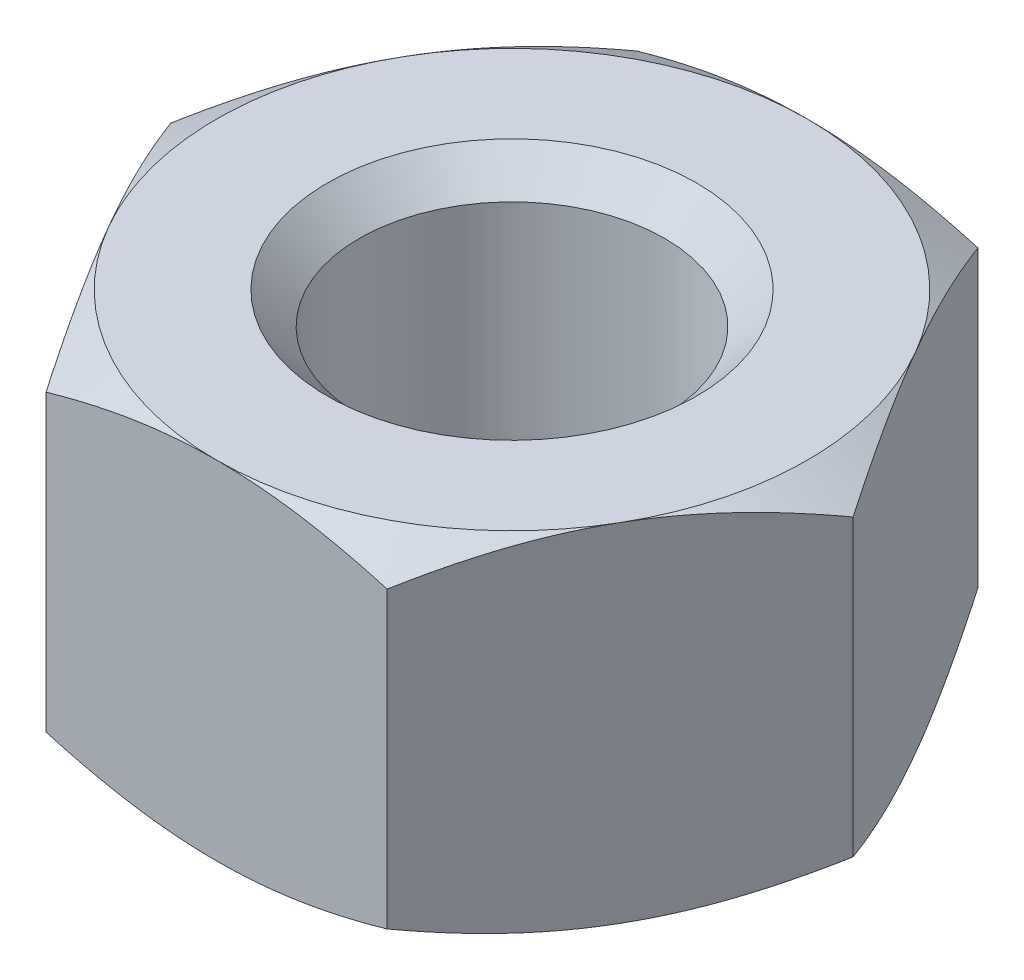
ISO-10303-21;
HEADER;
FILE_DESCRIPTION(('STEP AP214'),'2;1');
FILE_NAME('part.step','',(''),(''),'','','');
FILE_SCHEMA(('AUTOMOTIVE_DESIGN { 1 0 10303 214 1 1 1 1 }'));
ENDSEC;
DATA;
#1=APPLICATION_CONTEXT('core data for automotive mechanical design processes');
#2=APPLICATION_PROTOCOL_DEFINITION('international standard','automotive_design',2000,#1);
#3=PRODUCT_CONTEXT('',#1,'mechanical');
#4=PRODUCT('Part','Part','',(#3));
#5=PRODUCT_RELATED_PRODUCT_CATEGORY('part','',(#4));
#6=PRODUCT_DEFINITION_FORMATION('','',#4);
#7=PRODUCT_DEFINITION_CONTEXT('part definition',#1,'design');
#8=PRODUCT_DEFINITION('design','',#6,#7);
#9=PRODUCT_DEFINITION_SHAPE('','',#8);
#10=(LENGTH_UNIT() NAMED_UNIT(*) SI_UNIT(.MILLI.,.METRE.));
#11=(NAMED_UNIT(*) PLANE_ANGLE_UNIT() SI_UNIT($,.RADIAN.));
#12=(NAMED_UNIT(*) SI_UNIT($,.STERADIAN.) SOLID_ANGLE_UNIT());
#13=UNCERTAINTY_MEASURE_WITH_UNIT(LENGTH_MEASURE(1.E-05),#10,'distance_accuracy_value','');
#14=(GEOMETRIC_REPRESENTATION_CONTEXT(3) GLOBAL_UNCERTAINTY_ASSIGNED_CONTEXT((#13)) GLOBAL_UNIT_ASSIGNED_CONTEXT((#10,
#11,#12)) REPRESENTATION_CONTEXT('',''));
#15=CARTESIAN_POINT('',(0.,0.,0.));
#16=DIRECTION('',(0.,0.,1.));
#17=DIRECTION('',(1.,0.,0.));
#18=AXIS2_PLACEMENT_3D('',#15,#16,#17);
#19=CARTESIAN_POINT('',(0.,0.,0.));
#20=DIRECTION('',(0.,1.,0.));
#21=DIRECTION('',(0.,0.,1.));
#22=AXIS2_PLACEMENT_3D('',#19,#20,#21);
#23=CONICAL_SURFACE('',#22,4.,1.0471975511966);
#24=CARTESIAN_POINT('',(-4.61880330821755,0.357266256575081,1.99999999892675E-06));
#25=CARTESIAN_POINT('',(-4.51731909764557,0.298657292071255,-0.175773808876671));
#26=CARTESIAN_POINT('',(-4.4149588768546,0.245355497856662,-0.353066911960607));
#27=CARTESIAN_POINT('',(-4.20846613493174,0.152318797743035,-0.710722832365203));
#28=CARTESIAN_POINT('',(-4.10432994600602,0.112616801142602,-0.891092002491144));
#29=CARTESIAN_POINT('',(-3.89734807632659,0.0508177548489514,-1.2495951170215));
#30=CARTESIAN_POINT('',(-3.79453423354484,0.0283093507401665,-1.4276739164409));
#31=CARTESIAN_POINT('',(-3.58842302498515,0.00144399311373537,-1.78466900167571));
#32=CARTESIAN_POINT('',(-3.48512640785602,-0.00293521253205963,-1.96358399079337));
#33=CARTESIAN_POINT('',(-3.29212760794636,0.00619808923008941,-2.29786771803671));
#34=CARTESIAN_POINT('',(-3.20239646475493,0.0174680682685133,-2.4532866170655));
#35=CARTESIAN_POINT('',(-3.02351874775929,0.0531801293376515,-2.76311191124388));
#36=CARTESIAN_POINT('',(-2.93437279218783,0.0776343987077922,-2.91751723558292));
#37=CARTESIAN_POINT('',(-2.7551265674533,0.138765364665783,-3.22798080388804));
#38=CARTESIAN_POINT('',(-2.66504897298206,0.1757010716321,-3.38399977413581));
#39=CARTESIAN_POINT('',(-2.4862369061122,0.259529521182041,-3.69371135896082));
#40=CARTESIAN_POINT('',(-2.39750014467494,0.30640257994092,-3.84740793826927));
#41=CARTESIAN_POINT('',(-2.30939992205797,0.35726625657508,-4.000002));
#42=B_SPLINE_CURVE_WITH_KNOTS('',3,(#24,#25,#26,#27,#28,#29,#30,#31,#32,#33,#34,#35,#36,#37,#38,
#39,#40,#41),.UNSPECIFIED.,.F.,.F.,(4,2,2,2,2,2,2,2,4),(0.,0.634032181234025,1.26958795462497,
1.88941567588753,2.50848238266276,3.04741719213437,3.58685104031438,4.1382469778288,
4.68856075235001),.UNSPECIFIED.);
#43=CARTESIAN_POINT('',(-3.46410161513775,0.,-2.));
#44=VERTEX_POINT('',#43);
#45=CARTESIAN_POINT('',(-2.3094010767585,0.357265589908163,-4.));
#46=VERTEX_POINT('',#45);
#47=EDGE_CURVE('E222',#44,#46,#42,.T.);
#48=ORIENTED_EDGE('',*,*,#47,.T.);
#49=CARTESIAN_POINT('',(-6.12496791328576,1.91415319023748,-4.));
#50=CARTESIAN_POINT('',(-5.94934454674692,1.82928188046009,-4.));
#51=CARTESIAN_POINT('',(-5.77330595944165,1.74525423234508,-4.));
#52=CARTESIAN_POINT('',(-5.42017383412661,1.57936835460172,-4.));
#53=CARTESIAN_POINT('',(-5.24308011989033,1.49751050056147,-4.));
#54=CARTESIAN_POINT('',(-4.88665663294971,1.33601509539964,-4.));
#55=CARTESIAN_POINT('',(-4.70731986372955,1.25639292996096,-4.));
#56=CARTESIAN_POINT('',(-4.34717236999863,1.10056842575945,-4.));
#57=CARTESIAN_POINT('',(-4.16636172289676,1.02436590874491,-4.));
#58=CARTESIAN_POINT('',(-3.80073383205831,0.875385174541293,-4.));
#59=CARTESIAN_POINT('',(-3.61589465300084,0.802660495670861,-4.));
#60=CARTESIAN_POINT('',(-3.24403613492685,0.662906680302123,-4.));
#61=CARTESIAN_POINT('',(-3.05701655598148,0.595878177461809,-4.));
#62=CARTESIAN_POINT('',(-2.68088378597247,0.469317681556577,-4.));
#63=CARTESIAN_POINT('',(-2.49177601262329,0.409769751778633,-4.));
#64=CARTESIAN_POINT('',(-2.11087204671964,0.300104263766314,-4.));
#65=CARTESIAN_POINT('',(-1.91907672500189,0.249983723410642,-4.));
#66=CARTESIAN_POINT('',(-1.53266670507117,0.161606179599127,-4.));
#67=CARTESIAN_POINT('',(-1.3380512717393,0.12335232985726,-4.));
#68=CARTESIAN_POINT('',(-0.946473904052724,0.0612837042111804,-4.));
#69=CARTESIAN_POINT('',(-0.749511967640737,0.0374689409672343,-4.));
#70=CARTESIAN_POINT('',(-0.355519691096354,0.00638525989059735,-4.));
#71=CARTESIAN_POINT('',(-0.158497830861486,-0.000988416177660899,-4.));
#72=CARTESIAN_POINT('',(0.235408087238719,0.00120185676655598,-4.));
#73=CARTESIAN_POINT('',(0.432292167601184,0.0107614086185328,-4.));
#74=CARTESIAN_POINT('',(0.76849724477752,0.0408718597165423,-4.));
#75=CARTESIAN_POINT('',(0.908189149006597,0.0575009490345312,-4.));
#76=CARTESIAN_POINT('',(1.18649394400598,0.0982020119049957,-4.));
#77=CARTESIAN_POINT('',(1.32510666107962,0.12227515919873,-4.));
#78=CARTESIAN_POINT('',(1.73921300262621,0.20439728470357,-4.));
#79=CARTESIAN_POINT('',(2.01276564710678,0.272327804475224,-4.));
#80=CARTESIAN_POINT('',(2.4220957629485,0.389490408321359,-4.));
#81=CARTESIAN_POINT('',(2.56000684474927,0.431686387730949,-4.));
#82=CARTESIAN_POINT('',(2.83438958957609,0.520253865037997,-4.));
#83=CARTESIAN_POINT('',(2.97086217385934,0.566622483018704,-4.));
#84=CARTESIAN_POINT('',(3.24179724020976,0.662570371320852,-4.));
#85=CARTESIAN_POINT('',(3.37626671271993,0.712130101245038,-4.));
#86=CARTESIAN_POINT('',(3.64416233700232,0.814158580056112,-4.));
#87=CARTESIAN_POINT('',(3.77758804191473,0.866628504588586,-4.));
#88=CARTESIAN_POINT('',(3.91053130066118,0.920266349538454,-4.));
#89=B_SPLINE_CURVE_WITH_KNOTS('',3,(#49,#50,#51,#52,#53,#54,#55,#56,#57,#58,#59,#60,#61,#62,#63,
#64,#65,#66,#67,#68,#69,#70,#71,#72,#73,#74,#75,#76,#77,#78,#79,#80,#81,#82,#83,#84,#85,#86,#87,
#88),.UNSPECIFIED.,.F.,.F.,(4,2,2,2,2,2,2,2,2,2,2,2,2,2,2,2,2,2,2,4),(0.,0.585174800843114,
1.17045024170061,1.7590748100038,2.34766866009096,2.94349007578714,3.53937768573826,
4.13397346685478,4.72838084483344,5.32294605856348,5.91751179361064,6.50827815512904,
7.09889113102511,7.52071973285857,7.94261488042752,8.78703304772405,9.21966451857854,
9.65199964840548,10.0819013472715,10.5119779988031),.UNSPECIFIED.);
#90=CARTESIAN_POINT('',(0.,0.,-4.));
#91=VERTEX_POINT('',#90);
#92=EDGE_CURVE('E118',#46,#91,#89,.T.);
#93=ORIENTED_EDGE('',*,*,#92,.T.);
#94=CARTESIAN_POINT('',(0.,0.,0.));
#95=DIRECTION('',(0.,-1.,0.));
#96=DIRECTION('',(0.,0.,-1.));
#97=AXIS2_PLACEMENT_3D('',#94,#95,#96);
#98=CIRCLE('',#97,4.);
#99=EDGE_CURVE('E254',#44,#91,#98,.T.);
#100=ORIENTED_EDGE('',*,*,#99,.F.);
#101=EDGE_LOOP('',(#48,#93,#100));
#102=FACE_BOUND('',#101,.T.);
#103=ADVANCED_FACE('F15',(#102),#23,.T.);
#104=CARTESIAN_POINT('',(3.46410161513775,0.,-2.));
#105=VERTEX_POINT('',#104);
#106=EDGE_CURVE('E246',#91,#105,#98,.T.);
#107=ORIENTED_EDGE('',*,*,#106,.F.);
#108=CARTESIAN_POINT('',(2.30940107675851,0.357265589908163,-4.));
#109=VERTEX_POINT('',#108);
#110=EDGE_CURVE('E216',#91,#109,#89,.T.);
#111=ORIENTED_EDGE('',*,*,#110,.T.);
#112=CARTESIAN_POINT('',(2.30939992205797,0.35726625657508,-4.000002));
#113=CARTESIAN_POINT('',(2.41088413262994,0.298657292071257,-3.82422619112333));
#114=CARTESIAN_POINT('',(2.51324435342091,0.245355497856665,-3.64693308803939));
#115=CARTESIAN_POINT('',(2.71973709534377,0.152318797743039,-3.2892771676348));
#116=CARTESIAN_POINT('',(2.82387328426949,0.112616801142605,-3.10890799750885));
#117=CARTESIAN_POINT('',(3.03085515394892,0.0508177548489549,-2.75040488297849));
#118=CARTESIAN_POINT('',(3.13366899673067,0.0283093507401705,-2.5723260835591));
#119=CARTESIAN_POINT('',(3.33978020529036,0.00144399311373762,-2.21533099832428));
#120=CARTESIAN_POINT('',(3.44307682241949,-0.00293521253205958,-2.03641600920663));
#121=CARTESIAN_POINT('',(3.63607562232915,0.00619808923008982,-1.70213228196329));
#122=CARTESIAN_POINT('',(3.72580676552058,0.0174680682685157,-1.5467133829345));
#123=CARTESIAN_POINT('',(3.90468448251622,0.0531801293376555,-1.23688808875612));
#124=CARTESIAN_POINT('',(3.99383043808768,0.0776343987077959,-1.08248276441708));
#125=CARTESIAN_POINT('',(4.17307666282221,0.138765364665786,-0.772019196111962));
#126=CARTESIAN_POINT('',(4.26315425729345,0.175701071632103,-0.61600022586419));
#127=CARTESIAN_POINT('',(4.44196632416331,0.259529521182044,-0.306288641039182));
#128=CARTESIAN_POINT('',(4.53070308560057,0.306402579940922,-0.152592061730728));
#129=CARTESIAN_POINT('',(4.61880330821755,0.35726625657508,2.00000000027449E-06));
#130=B_SPLINE_CURVE_WITH_KNOTS('',3,(#112,#113,#114,#115,#116,#117,#118,#119,#120,#121,#122,
#123,#124,#125,#126,#127,#128,#129),.UNSPECIFIED.,.F.,.F.,(4,2,2,2,2,2,2,2,4),(0.,
0.634032181234024,1.26958795462496,1.88941567588753,2.50848238266275,3.04741719213436,
3.58685104031437,4.1382469778288,4.68856075235001),.UNSPECIFIED.);
#131=EDGE_CURVE('E210',#109,#105,#130,.T.);
#132=ORIENTED_EDGE('',*,*,#131,.T.);
#133=EDGE_LOOP('',(#107,#111,#132));
#134=FACE_BOUND('',#133,.T.);
#135=ADVANCED_FACE('F243',(#134),#23,.T.);
#136=CARTESIAN_POINT('',(3.46410161513775,0.,2.));
#137=VERTEX_POINT('',#136);
#138=EDGE_CURVE('E252',#105,#137,#98,.T.);
#139=ORIENTED_EDGE('',*,*,#138,.F.);
#140=CARTESIAN_POINT('',(4.61880215351701,0.357265589908163,0.));
#141=VERTEX_POINT('',#140);
#142=EDGE_CURVE('E202',#105,#141,#130,.T.);
#143=ORIENTED_EDGE('',*,*,#142,.T.);
#144=CARTESIAN_POINT('',(4.61880330821754,0.35726625657508,-1.99999999971719E-06));
#145=CARTESIAN_POINT('',(4.51731909764557,0.298657292071254,0.175773808876672));
#146=CARTESIAN_POINT('',(4.4149588768546,0.245355497856662,0.353066911960608));
#147=CARTESIAN_POINT('',(4.20846613493174,0.152318797743036,0.710722832365205));
#148=CARTESIAN_POINT('',(4.10432994600602,0.112616801142602,0.891092002491145));
#149=CARTESIAN_POINT('',(3.8973480763266,0.0508177548489516,1.2495951170215));
#150=CARTESIAN_POINT('',(3.79453423354484,0.0283093507401669,1.4276739164409));
#151=CARTESIAN_POINT('',(3.58842302498515,0.00144399311373523,1.78466900167571));
#152=CARTESIAN_POINT('',(3.48512640785602,-0.00293521253206043,1.96358399079336));
#153=CARTESIAN_POINT('',(3.29212760794636,0.00619808923008863,2.29786771803671));
#154=CARTESIAN_POINT('',(3.20239646475493,0.0174680682685131,2.45328661706549));
#155=CARTESIAN_POINT('',(3.02351874775929,0.0531801293376517,2.76311191124388));
#156=CARTESIAN_POINT('',(2.93437279218783,0.0776343987077922,2.91751723558292));
#157=CARTESIAN_POINT('',(2.7551265674533,0.138765364665782,3.22798080388804));
#158=CARTESIAN_POINT('',(2.66504897298206,0.1757010716321,3.38399977413581));
#159=CARTESIAN_POINT('',(2.4862369061122,0.259529521182041,3.69371135896082));
#160=CARTESIAN_POINT('',(2.39750014467494,0.306402579940921,3.84740793826927));
#161=CARTESIAN_POINT('',(2.30939992205796,0.357266256575081,4.000002));
#162=B_SPLINE_CURVE_WITH_KNOTS('',3,(#144,#145,#146,#147,#148,#149,#150,#151,#152,#153,#154,
#155,#156,#157,#158,#159,#160,#161),.UNSPECIFIED.,.F.,.F.,(4,2,2,2,2,2,2,2,4),(0.,
0.634032181234023,1.26958795462496,1.88941567588752,2.50848238266275,3.04741719213436,
3.58685104031437,4.1382469778288,4.68856075235001),.UNSPECIFIED.);
#163=EDGE_CURVE('E361',#141,#137,#162,.T.);
#164=ORIENTED_EDGE('',*,*,#163,.T.);
#165=EDGE_LOOP('',(#139,#143,#164));
#166=FACE_BOUND('',#165,.T.);
#167=ADVANCED_FACE('F330',(#166),#23,.T.);
#168=CARTESIAN_POINT('',(-2.30939992205797,0.357266256575081,4.000002));
#169=CARTESIAN_POINT('',(-2.41088413262994,0.298657292071257,3.82422619112333));
#170=CARTESIAN_POINT('',(-2.51324435342091,0.245355497856665,3.64693308803939));
#171=CARTESIAN_POINT('',(-2.71973709534377,0.152318797743039,3.2892771676348));
#172=CARTESIAN_POINT('',(-2.82387328426949,0.112616801142605,3.10890799750885));
#173=CARTESIAN_POINT('',(-3.03085515394892,0.0508177548489549,2.75040488297849));
#174=CARTESIAN_POINT('',(-3.13366899673067,0.0283093507401703,2.5723260835591));
#175=CARTESIAN_POINT('',(-3.33978020529036,0.00144399311373751,2.21533099832428));
#176=CARTESIAN_POINT('',(-3.44307682241949,-0.00293521253205965,2.03641600920663));
#177=CARTESIAN_POINT('',(-3.63607562232915,0.00619808923008974,1.70213228196329));
#178=CARTESIAN_POINT('',(-3.72580676552058,0.0174680682685155,1.5467133829345));
#179=CARTESIAN_POINT('',(-3.90468448251622,0.0531801293376554,1.23688808875612));
#180=CARTESIAN_POINT('',(-3.99383043808768,0.0776343987077958,1.08248276441708));
#181=CARTESIAN_POINT('',(-4.17307666282221,0.138765364665786,0.772019196111962));
#182=CARTESIAN_POINT('',(-4.26315425729345,0.175701071632103,0.61600022586419));
#183=CARTESIAN_POINT('',(-4.44196632416331,0.259529521182044,0.306288641039182));
#184=CARTESIAN_POINT('',(-4.53070308560057,0.306402579940922,0.152592061730727));
#185=CARTESIAN_POINT('',(-4.61880330821755,0.35726625657508,-2.00000000108303E-06));
#186=B_SPLINE_CURVE_WITH_KNOTS('',3,(#168,#169,#170,#171,#172,#173,#174,#175,#176,#177,#178,
#179,#180,#181,#182,#183,#184,#185),.UNSPECIFIED.,.F.,.F.,(4,2,2,2,2,2,2,2,4),(0.,
0.634032181234023,1.26958795462496,1.88941567588753,2.50848238266275,3.04741719213436,
3.58685104031437,4.1382469778288,4.68856075235001),.UNSPECIFIED.);
#187=CARTESIAN_POINT('',(-3.46410161513775,0.,2.));
#188=VERTEX_POINT('',#187);
#189=CARTESIAN_POINT('',(-4.61880215351701,0.357265589908164,0.));
#190=VERTEX_POINT('',#189);
#191=EDGE_CURVE('E355',#188,#190,#186,.T.);
#192=ORIENTED_EDGE('',*,*,#191,.T.);
#193=EDGE_CURVE('E211',#190,#44,#42,.T.);
#194=ORIENTED_EDGE('',*,*,#193,.T.);
#195=EDGE_CURVE('E262',#188,#44,#98,.T.);
#196=ORIENTED_EDGE('',*,*,#195,.F.);
#197=EDGE_LOOP('',(#192,#194,#196));
#198=FACE_BOUND('',#197,.T.);
#199=ADVANCED_FACE('F338',(#198),#23,.T.);
#200=CARTESIAN_POINT('',(0.,0.,4.));
#201=VERTEX_POINT('',#200);
#202=EDGE_CURVE('E260',#137,#201,#98,.T.);
#203=ORIENTED_EDGE('',*,*,#202,.F.);
#204=CARTESIAN_POINT('',(2.3094010767585,0.357265589908163,4.));
#205=VERTEX_POINT('',#204);
#206=EDGE_CURVE('E37',#137,#205,#162,.T.);
#207=ORIENTED_EDGE('',*,*,#206,.T.);
#208=CARTESIAN_POINT('',(-6.12496791328576,1.91415319023748,4.));
#209=CARTESIAN_POINT('',(-5.94934454674692,1.82928188046009,4.));
#210=CARTESIAN_POINT('',(-5.77330595944165,1.74525423234508,4.));
#211=CARTESIAN_POINT('',(-5.42017383412661,1.57936835460172,4.));
#212=CARTESIAN_POINT('',(-5.24308011989033,1.49751050056147,4.));
#213=CARTESIAN_POINT('',(-4.88665663294971,1.33601509539964,4.));
#214=CARTESIAN_POINT('',(-4.70731986372955,1.25639292996096,4.));
#215=CARTESIAN_POINT('',(-4.34717236999863,1.10056842575945,4.));
#216=CARTESIAN_POINT('',(-4.16636172289676,1.02436590874491,4.));
#217=CARTESIAN_POINT('',(-3.80073383205831,0.875385174541293,4.));
#218=CARTESIAN_POINT('',(-3.61589465300084,0.802660495670861,4.));
#219=CARTESIAN_POINT('',(-3.24403613492686,0.662906680302123,4.));
#220=CARTESIAN_POINT('',(-3.05701655598148,0.595878177461809,4.));
#221=CARTESIAN_POINT('',(-2.68088378597247,0.469317681556577,4.));
#222=CARTESIAN_POINT('',(-2.49177601262329,0.409769751778634,4.));
#223=CARTESIAN_POINT('',(-2.11087204671965,0.300104263766314,4.));
#224=CARTESIAN_POINT('',(-1.91907672500189,0.249983723410642,4.));
#225=CARTESIAN_POINT('',(-1.53266670507117,0.161606179599127,4.));
#226=CARTESIAN_POINT('',(-1.33805127173931,0.123352329857261,4.));
#227=CARTESIAN_POINT('',(-0.946473904052728,0.0612837042111814,4.));
#228=CARTESIAN_POINT('',(-0.749511967640741,0.0374689409672346,4.));
#229=CARTESIAN_POINT('',(-0.355519691096358,0.00638525989059739,4.));
#230=CARTESIAN_POINT('',(-0.15849783086149,-0.000988416177660527,4.));
#231=CARTESIAN_POINT('',(0.235408087238715,0.0012018567665566,4.));
#232=CARTESIAN_POINT('',(0.432292167601181,0.0107614086185333,4.));
#233=CARTESIAN_POINT('',(0.768497244777516,0.0408718597165427,4.));
#234=CARTESIAN_POINT('',(0.908189149006593,0.0575009490345317,4.));
#235=CARTESIAN_POINT('',(1.18649394400598,0.0982020119049961,4.));
#236=CARTESIAN_POINT('',(1.32510666107962,0.122275159198731,4.));
#237=CARTESIAN_POINT('',(1.7392130026262,0.20439728470357,4.));
#238=CARTESIAN_POINT('',(2.01276564710678,0.272327804475224,4.));
#239=CARTESIAN_POINT('',(2.42209576294849,0.38949040832136,4.));
#240=CARTESIAN_POINT('',(2.56000684474927,0.43168638773095,4.));
#241=CARTESIAN_POINT('',(2.83438958957609,0.520253865037999,4.));
#242=CARTESIAN_POINT('',(2.97086217385934,0.566622483018705,4.));
#243=CARTESIAN_POINT('',(3.24179724020976,0.662570371320853,4.));
#244=CARTESIAN_POINT('',(3.37626671271993,0.712130101245039,4.));
#245=CARTESIAN_POINT('',(3.64416233700232,0.814158580056115,4.));
#246=CARTESIAN_POINT('',(3.77758804191473,0.866628504588589,4.));
#247=CARTESIAN_POINT('',(3.91053130066118,0.920266349538457,4.));
#248=B_SPLINE_CURVE_WITH_KNOTS('',3,(#208,#209,#210,#211,#212,#213,#214,#215,#216,#217,#218,
#219,#220,#221,#222,#223,#224,#225,#226,#227,#228,#229,#230,#231,#232,#233,#234,#235,#236,#237,
#238,#239,#240,#241,#242,#243,#244,#245,#246,#247),.UNSPECIFIED.,.F.,.F.,(4,2,2,2,2,2,2,2,2,2,2,
2,2,2,2,2,2,2,2,4),(0.,0.585174800843114,1.17045024170061,1.7590748100038,2.34766866009095,
2.94349007578714,3.53937768573826,4.13397346685478,4.72838084483343,5.32294605856347,
5.91751179361063,6.50827815512903,7.09889113102511,7.52071973285856,7.94261488042752,
8.78703304772405,9.21966451857854,9.65199964840548,10.0819013472715,10.5119779988031),.UNSPECIFIED.);
#249=EDGE_CURVE('E10',#205,#201,#248,.F.);
#250=ORIENTED_EDGE('',*,*,#249,.T.);
#251=EDGE_LOOP('',(#203,#207,#250));
#252=FACE_BOUND('',#251,.T.);
#253=ADVANCED_FACE('F333',(#252),#23,.T.);
#254=CARTESIAN_POINT('',(-2.30940107675851,0.357265589908163,4.));
#255=VERTEX_POINT('',#254);
#256=EDGE_CURVE('E20',#201,#255,#248,.F.);
#257=ORIENTED_EDGE('',*,*,#256,.T.);
#258=EDGE_CURVE('E125',#255,#188,#186,.T.);
#259=ORIENTED_EDGE('',*,*,#258,.T.);
#260=EDGE_CURVE('E269',#201,#188,#98,.T.);
#261=ORIENTED_EDGE('',*,*,#260,.F.);
#262=EDGE_LOOP('',(#257,#259,#261));
#263=FACE_BOUND('',#262,.T.);
#264=ADVANCED_FACE('F152',(#263),#23,.T.);
#265=CARTESIAN_POINT('',(0.,4.34204283310244,0.));
#266=DIRECTION('',(0.,-1.,0.));
#267=DIRECTION('',(0.,0.,-1.));
#268=AXIS2_PLACEMENT_3D('',#265,#266,#267);
#269=CONICAL_SURFACE('',#268,4.62,1.0471975511966);
#270=CARTESIAN_POINT('',(-6.12496791328576,2.78584680976252,4.));
#271=CARTESIAN_POINT('',(-5.94934454674692,2.87071811953991,4.));
#272=CARTESIAN_POINT('',(-5.77330595944165,2.95474576765493,4.));
#273=CARTESIAN_POINT('',(-5.42017383412661,3.12063164539828,4.));
#274=CARTESIAN_POINT('',(-5.24308011989033,3.20248949943853,4.));
#275=CARTESIAN_POINT('',(-4.88665663294971,3.36398490460037,4.));
#276=CARTESIAN_POINT('',(-4.70731986372955,3.44360707003904,4.));
#277=CARTESIAN_POINT('',(-4.34717236999863,3.59943157424055,4.));
#278=CARTESIAN_POINT('',(-4.16636172289676,3.67563409125509,4.));
#279=CARTESIAN_POINT('',(-3.80073383205831,3.82461482545871,4.));
#280=CARTESIAN_POINT('',(-3.61589465300084,3.89733950432914,4.));
#281=CARTESIAN_POINT('',(-3.24403613492686,4.03709331969788,4.));
#282=CARTESIAN_POINT('',(-3.05701655598148,4.10412182253819,4.));
#283=CARTESIAN_POINT('',(-2.68088378597247,4.23068231844343,4.));
#284=CARTESIAN_POINT('',(-2.49177601262329,4.29023024822137,4.));
#285=CARTESIAN_POINT('',(-2.11087204671965,4.39989573623369,4.));
#286=CARTESIAN_POINT('',(-1.91907672500189,4.45001627658936,4.));
#287=CARTESIAN_POINT('',(-1.53266670507117,4.53839382040087,4.));
#288=CARTESIAN_POINT('',(-1.33805127173931,4.57664767014274,4.));
#289=CARTESIAN_POINT('',(-0.946473904052728,4.63871629578882,4.));
#290=CARTESIAN_POINT('',(-0.749511967640742,4.66253105903277,4.));
#291=CARTESIAN_POINT('',(-0.355519691096358,4.69361474010941,4.));
#292=CARTESIAN_POINT('',(-0.15849783086149,4.70098841617766,4.));
#293=CARTESIAN_POINT('',(0.235408087238715,4.69879814323345,4.));
#294=CARTESIAN_POINT('',(0.432292167601181,4.68923859138147,4.));
#295=CARTESIAN_POINT('',(0.768497244777516,4.65912814028346,4.));
#296=CARTESIAN_POINT('',(0.908189149006594,4.64249905096547,4.));
#297=CARTESIAN_POINT('',(1.18649394400598,4.60179798809501,4.));
#298=CARTESIAN_POINT('',(1.32510666107962,4.57772484080127,4.));
#299=CARTESIAN_POINT('',(1.73921300262621,4.49560271529643,4.));
#300=CARTESIAN_POINT('',(2.01276564710678,4.42767219552478,4.));
#301=CARTESIAN_POINT('',(2.4220957629485,4.31050959167864,4.));
#302=CARTESIAN_POINT('',(2.56000684474927,4.26831361226905,4.));
#303=CARTESIAN_POINT('',(2.83438958957609,4.179746134962,4.));
#304=CARTESIAN_POINT('',(2.97086217385935,4.1333775169813,4.));
#305=CARTESIAN_POINT('',(3.24179724020977,4.03742962867915,4.));
#306=CARTESIAN_POINT('',(3.37626671271993,3.98786989875496,4.));
#307=CARTESIAN_POINT('',(3.64416233700232,3.88584141994389,4.));
#308=CARTESIAN_POINT('',(3.77758804191473,3.83337149541141,4.));
#309=CARTESIAN_POINT('',(3.91053130066119,3.77973365046154,4.));
#310=B_SPLINE_CURVE_WITH_KNOTS('',3,(#270,#271,#272,#273,#274,#275,#276,#277,#278,#279,#280,
#281,#282,#283,#284,#285,#286,#287,#288,#289,#290,#291,#292,#293,#294,#295,#296,#297,#298,#299,
#300,#301,#302,#303,#304,#305,#306,#307,#308,#309),.UNSPECIFIED.,.F.,.F.,(4,2,2,2,2,2,2,2,2,2,2,
2,2,2,2,2,2,2,2,4),(0.,0.585174800843115,1.17045024170061,1.7590748100038,2.34766866009095,
2.94349007578714,3.53937768573825,4.13397346685478,4.72838084483343,5.32294605856347,
5.91751179361063,6.50827815512903,7.09889113102511,7.52071973285857,7.94261488042752,
8.78703304772405,9.21966451857855,9.65199964840548,10.0819013472715,10.5119779988031),.UNSPECIFIED.);
#311=CARTESIAN_POINT('',(0.,4.7,4.));
#312=VERTEX_POINT('',#311);
#313=CARTESIAN_POINT('',(2.3094010767585,4.34273441009184,4.));
#314=VERTEX_POINT('',#313);
#315=EDGE_CURVE('E114',#312,#314,#310,.T.);
#316=ORIENTED_EDGE('',*,*,#315,.T.);
#317=CARTESIAN_POINT('',(2.30939992205796,4.34273374342492,4.000002));
#318=CARTESIAN_POINT('',(2.41088413262993,4.40134270792875,3.82422619112333));
#319=CARTESIAN_POINT('',(2.51324435342091,4.45464450214334,3.64693308803939));
#320=CARTESIAN_POINT('',(2.71973709534376,4.54768120225697,3.2892771676348));
#321=CARTESIAN_POINT('',(2.82387328426948,4.5873831988574,3.10890799750886));
#322=CARTESIAN_POINT('',(3.03085515394891,4.64918224515105,2.7504048829785));
#323=CARTESIAN_POINT('',(3.13366899673066,4.67169064925984,2.5723260835591));
#324=CARTESIAN_POINT('',(3.33978020529035,4.69855600688627,2.21533099832429));
#325=CARTESIAN_POINT('',(3.44307682241949,4.70293521253206,2.03641600920664));
#326=CARTESIAN_POINT('',(3.63607562232915,4.69380191076991,1.70213228196329));
#327=CARTESIAN_POINT('',(3.72580676552057,4.68253193173149,1.54671338293451));
#328=CARTESIAN_POINT('',(3.90468448251621,4.64681987066235,1.23688808875612));
#329=CARTESIAN_POINT('',(3.99383043808767,4.62236560129221,1.08248276441708));
#330=CARTESIAN_POINT('',(4.1730766628222,4.56123463533422,0.772019196111963));
#331=CARTESIAN_POINT('',(4.26315425729344,4.5242989283679,0.616000225864192));
#332=CARTESIAN_POINT('',(4.4419663241633,4.44047047881796,0.306288641039183));
#333=CARTESIAN_POINT('',(4.53070308560057,4.39359742005908,0.152592061730728));
#334=CARTESIAN_POINT('',(4.61880330821754,4.34273374342492,-1.99999999929253E-06));
#335=B_SPLINE_CURVE_WITH_KNOTS('',3,(#317,#318,#319,#320,#321,#322,#323,#324,#325,#326,#327,
#328,#329,#330,#331,#332,#333,#334),.UNSPECIFIED.,.F.,.F.,(4,2,2,2,2,2,2,2,4),(0.,
0.634032181234024,1.26958795462496,1.88941567588752,2.50848238266275,3.04741719213436,
3.58685104031437,4.1382469778288,4.68856075235001),.UNSPECIFIED.);
#336=CARTESIAN_POINT('',(3.46410161513775,4.7,2.));
#337=VERTEX_POINT('',#336);
#338=EDGE_CURVE('E120',#314,#337,#335,.T.);
#339=ORIENTED_EDGE('',*,*,#338,.T.);
#340=CARTESIAN_POINT('',(0.,4.7,0.));
#341=DIRECTION('',(0.,-1.,0.));
#342=DIRECTION('',(0.,0.,-1.));
#343=AXIS2_PLACEMENT_3D('',#340,#341,#342);
#344=CIRCLE('',#343,4.);
#345=EDGE_CURVE('E128',#337,#312,#344,.T.);
#346=ORIENTED_EDGE('',*,*,#345,.T.);
#347=EDGE_LOOP('',(#316,#339,#346));
#348=FACE_BOUND('',#347,.T.);
#349=ADVANCED_FACE('F127',(#348),#269,.T.);
#350=CARTESIAN_POINT('',(3.46410161513775,4.7,-2.));
#351=VERTEX_POINT('',#350);
#352=EDGE_CURVE('E272',#351,#337,#344,.T.);
#353=ORIENTED_EDGE('',*,*,#352,.T.);
#354=CARTESIAN_POINT('',(4.61880215351701,4.34273441009184,0.));
#355=VERTEX_POINT('',#354);
#356=EDGE_CURVE('E44',#337,#355,#335,.T.);
#357=ORIENTED_EDGE('',*,*,#356,.T.);
#358=CARTESIAN_POINT('',(4.61880330821755,4.34273374342492,2.00000000035317E-06));
#359=CARTESIAN_POINT('',(4.51731909764558,4.40134270792875,-0.175773808876672));
#360=CARTESIAN_POINT('',(4.4149588768546,4.45464450214334,-0.353066911960608));
#361=CARTESIAN_POINT('',(4.20846613493174,4.54768120225696,-0.710722832365205));
#362=CARTESIAN_POINT('',(4.10432994600602,4.5873831988574,-0.891092002491145));
#363=CARTESIAN_POINT('',(3.8973480763266,4.64918224515105,-1.24959511702151));
#364=CARTESIAN_POINT('',(3.79453423354485,4.67169064925983,-1.4276739164409));
#365=CARTESIAN_POINT('',(3.58842302498515,4.69855600688626,-1.78466900167571));
#366=CARTESIAN_POINT('',(3.48512640785602,4.70293521253206,-1.96358399079336));
#367=CARTESIAN_POINT('',(3.29212760794636,4.69380191076991,-2.29786771803671));
#368=CARTESIAN_POINT('',(3.20239646475494,4.68253193173149,-2.4532866170655));
#369=CARTESIAN_POINT('',(3.02351874775929,4.64681987066235,-2.76311191124388));
#370=CARTESIAN_POINT('',(2.93437279218784,4.62236560129221,-2.91751723558292));
#371=CARTESIAN_POINT('',(2.75512656745331,4.56123463533422,-3.22798080388804));
#372=CARTESIAN_POINT('',(2.66504897298207,4.5242989283679,-3.38399977413581));
#373=CARTESIAN_POINT('',(2.4862369061122,4.44047047881796,-3.69371135896082));
#374=CARTESIAN_POINT('',(2.39750014467494,4.39359742005908,-3.84740793826927));
#375=CARTESIAN_POINT('',(2.30939992205797,4.34273374342492,-4.000002));
#376=B_SPLINE_CURVE_WITH_KNOTS('',3,(#358,#359,#360,#361,#362,#363,#364,#365,#366,#367,#368,
#369,#370,#371,#372,#373,#374,#375),.UNSPECIFIED.,.F.,.F.,(4,2,2,2,2,2,2,2,4),(0.,
0.634032181234025,1.26958795462496,1.88941567588752,2.50848238266275,3.04741719213436,
3.58685104031437,4.1382469778288,4.68856075235001),.UNSPECIFIED.);
#377=EDGE_CURVE('E188',#355,#351,#376,.T.);
#378=ORIENTED_EDGE('',*,*,#377,.T.);
#379=EDGE_LOOP('',(#353,#357,#378));
#380=FACE_BOUND('',#379,.T.);
#381=ADVANCED_FACE('F151',(#380),#269,.T.);
#382=CARTESIAN_POINT('',(0.,4.7,-4.));
#383=VERTEX_POINT('',#382);
#384=EDGE_CURVE('E263',#383,#351,#344,.T.);
#385=ORIENTED_EDGE('',*,*,#384,.T.);
#386=CARTESIAN_POINT('',(2.30940107675851,4.34273441009184,-4.));
#387=VERTEX_POINT('',#386);
#388=EDGE_CURVE('E182',#351,#387,#376,.T.);
#389=ORIENTED_EDGE('',*,*,#388,.T.);
#390=CARTESIAN_POINT('',(-6.12496791328576,2.78584680976252,-4.));
#391=CARTESIAN_POINT('',(-5.94934454674692,2.87071811953991,-4.));
#392=CARTESIAN_POINT('',(-5.77330595944165,2.95474576765493,-4.));
#393=CARTESIAN_POINT('',(-5.42017383412661,3.12063164539828,-4.));
#394=CARTESIAN_POINT('',(-5.24308011989032,3.20248949943853,-4.));
#395=CARTESIAN_POINT('',(-4.88665663294971,3.36398490460037,-4.));
#396=CARTESIAN_POINT('',(-4.70731986372955,3.44360707003904,-4.));
#397=CARTESIAN_POINT('',(-4.34717236999863,3.59943157424055,-4.));
#398=CARTESIAN_POINT('',(-4.16636172289676,3.67563409125509,-4.));
#399=CARTESIAN_POINT('',(-3.80073383205831,3.82461482545871,-4.));
#400=CARTESIAN_POINT('',(-3.61589465300084,3.89733950432914,-4.));
#401=CARTESIAN_POINT('',(-3.24403613492686,4.03709331969788,-4.));
#402=CARTESIAN_POINT('',(-3.05701655598148,4.10412182253819,-4.));
#403=CARTESIAN_POINT('',(-2.68088378597247,4.23068231844343,-4.));
#404=CARTESIAN_POINT('',(-2.49177601262329,4.29023024822137,-4.));
#405=CARTESIAN_POINT('',(-2.11087204671965,4.39989573623369,-4.));
#406=CARTESIAN_POINT('',(-1.91907672500189,4.45001627658936,-4.));
#407=CARTESIAN_POINT('',(-1.53266670507117,4.53839382040087,-4.));
#408=CARTESIAN_POINT('',(-1.33805127173931,4.57664767014274,-4.));
#409=CARTESIAN_POINT('',(-0.946473904052728,4.63871629578882,-4.));
#410=CARTESIAN_POINT('',(-0.749511967640741,4.66253105903277,-4.));
#411=CARTESIAN_POINT('',(-0.355519691096357,4.69361474010941,-4.));
#412=CARTESIAN_POINT('',(-0.158497830861488,4.70098841617766,-4.));
#413=CARTESIAN_POINT('',(0.235408087238717,4.69879814323345,-4.));
#414=CARTESIAN_POINT('',(0.432292167601183,4.68923859138147,-4.));
#415=CARTESIAN_POINT('',(0.768497244777519,4.65912814028346,-4.));
#416=CARTESIAN_POINT('',(0.908189149006598,4.64249905096547,-4.));
#417=CARTESIAN_POINT('',(1.18649394400598,4.60179798809501,-4.));
#418=CARTESIAN_POINT('',(1.32510666107962,4.57772484080127,-4.));
#419=CARTESIAN_POINT('',(1.73921300262621,4.49560271529643,-4.));
#420=CARTESIAN_POINT('',(2.01276564710678,4.42767219552478,-4.));
#421=CARTESIAN_POINT('',(2.4220957629485,4.31050959167864,-4.));
#422=CARTESIAN_POINT('',(2.56000684474928,4.26831361226905,-4.));
#423=CARTESIAN_POINT('',(2.8343895895761,4.179746134962,-4.));
#424=CARTESIAN_POINT('',(2.97086217385935,4.1333775169813,-4.));
#425=CARTESIAN_POINT('',(3.24179724020977,4.03742962867915,-4.));
#426=CARTESIAN_POINT('',(3.37626671271994,3.98786989875496,-4.));
#427=CARTESIAN_POINT('',(3.64416233700233,3.88584141994389,-4.));
#428=CARTESIAN_POINT('',(3.77758804191474,3.83337149541141,-4.));
#429=CARTESIAN_POINT('',(3.91053130066119,3.77973365046154,-4.));
#430=B_SPLINE_CURVE_WITH_KNOTS('',3,(#390,#391,#392,#393,#394,#395,#396,#397,#398,#399,#400,
#401,#402,#403,#404,#405,#406,#407,#408,#409,#410,#411,#412,#413,#414,#415,#416,#417,#418,#419,
#420,#421,#422,#423,#424,#425,#426,#427,#428,#429),.UNSPECIFIED.,.F.,.F.,(4,2,2,2,2,2,2,2,2,2,2,
2,2,2,2,2,2,2,2,4),(0.,0.585174800843116,1.17045024170061,1.7590748100038,2.34766866009096,
2.94349007578714,3.53937768573826,4.13397346685478,4.72838084483343,5.32294605856347,
5.91751179361063,6.50827815512903,7.09889113102511,7.52071973285857,7.94261488042753,
8.78703304772405,9.21966451857855,9.65199964840549,10.0819013472715,10.5119779988031),.UNSPECIFIED.);
#431=EDGE_CURVE('E189',#387,#383,#430,.F.);
#432=ORIENTED_EDGE('',*,*,#431,.T.);
#433=EDGE_LOOP('',(#385,#389,#432));
#434=FACE_BOUND('',#433,.T.);
#435=ADVANCED_FACE('F439',(#434),#269,.T.);
#436=CARTESIAN_POINT('',(-3.46410161513775,4.7,-2.));
#437=VERTEX_POINT('',#436);
#438=EDGE_CURVE('E273',#437,#383,#344,.T.);
#439=ORIENTED_EDGE('',*,*,#438,.T.);
#440=CARTESIAN_POINT('',(-2.3094010767585,4.34273441009184,-4.));
#441=VERTEX_POINT('',#440);
#442=EDGE_CURVE('E176',#383,#441,#430,.F.);
#443=ORIENTED_EDGE('',*,*,#442,.T.);
#444=CARTESIAN_POINT('',(-2.30939992205797,4.34273374342492,-4.000002));
#445=CARTESIAN_POINT('',(-2.41088413262993,4.40134270792875,-3.82422619112333));
#446=CARTESIAN_POINT('',(-2.51324435342091,4.45464450214334,-3.64693308803939));
#447=CARTESIAN_POINT('',(-2.71973709534376,4.54768120225697,-3.28927716763479));
#448=CARTESIAN_POINT('',(-2.82387328426949,4.5873831988574,-3.10890799750885));
#449=CARTESIAN_POINT('',(-3.03085515394891,4.64918224515105,-2.7504048829785));
#450=CARTESIAN_POINT('',(-3.13366899673066,4.67169064925984,-2.5723260835591));
#451=CARTESIAN_POINT('',(-3.33978020529035,4.69855600688627,-2.21533099832429));
#452=CARTESIAN_POINT('',(-3.44307682241949,4.70293521253206,-2.03641600920664));
#453=CARTESIAN_POINT('',(-3.63607562232915,4.69380191076991,-1.70213228196329));
#454=CARTESIAN_POINT('',(-3.72580676552057,4.68253193173149,-1.54671338293451));
#455=CARTESIAN_POINT('',(-3.90468448251622,4.64681987066235,-1.23688808875612));
#456=CARTESIAN_POINT('',(-3.99383043808767,4.62236560129221,-1.08248276441708));
#457=CARTESIAN_POINT('',(-4.1730766628222,4.56123463533422,-0.772019196111961));
#458=CARTESIAN_POINT('',(-4.26315425729344,4.5242989283679,-0.616000225864189));
#459=CARTESIAN_POINT('',(-4.44196632416331,4.44047047881796,-0.306288641039181));
#460=CARTESIAN_POINT('',(-4.53070308560057,4.39359742005908,-0.152592061730727));
#461=CARTESIAN_POINT('',(-4.61880330821755,4.34273374342492,1.99999999840629E-06));
#462=B_SPLINE_CURVE_WITH_KNOTS('',3,(#444,#445,#446,#447,#448,#449,#450,#451,#452,#453,#454,
#455,#456,#457,#458,#459,#460,#461),.UNSPECIFIED.,.F.,.F.,(4,2,2,2,2,2,2,2,4),(0.,
0.634032181234023,1.26958795462496,1.88941567588752,2.50848238266275,3.04741719213436,
3.58685104031437,4.1382469778288,4.68856075235001),.UNSPECIFIED.);
#463=EDGE_CURVE('E406',#441,#437,#462,.T.);
#464=ORIENTED_EDGE('',*,*,#463,.T.);
#465=EDGE_LOOP('',(#439,#443,#464));
#466=FACE_BOUND('',#465,.T.);
#467=ADVANCED_FACE('F435',(#466),#269,.T.);
#468=CARTESIAN_POINT('',(-3.46410161513775,4.7,2.));
#469=VERTEX_POINT('',#468);
#470=EDGE_CURVE('E283',#469,#437,#344,.T.);
#471=ORIENTED_EDGE('',*,*,#470,.T.);
#472=CARTESIAN_POINT('',(-4.61880215351701,4.34273441009184,0.));
#473=VERTEX_POINT('',#472);
#474=EDGE_CURVE('E170',#437,#473,#462,.T.);
#475=ORIENTED_EDGE('',*,*,#474,.T.);
#476=CARTESIAN_POINT('',(-4.61880330821755,4.34273374342492,-2.00000000111023E-06));
#477=CARTESIAN_POINT('',(-4.51731909764558,4.40134270792875,0.175773808876671));
#478=CARTESIAN_POINT('',(-4.4149588768546,4.45464450214334,0.353066911960607));
#479=CARTESIAN_POINT('',(-4.20846613493175,4.54768120225696,0.710722832365204));
#480=CARTESIAN_POINT('',(-4.10432994600602,4.5873831988574,0.891092002491144));
#481=CARTESIAN_POINT('',(-3.8973480763266,4.64918224515105,1.2495951170215));
#482=CARTESIAN_POINT('',(-3.79453423354485,4.67169064925983,1.4276739164409));
#483=CARTESIAN_POINT('',(-3.58842302498516,4.69855600688626,1.78466900167571));
#484=CARTESIAN_POINT('',(-3.48512640785602,4.70293521253206,1.96358399079336));
#485=CARTESIAN_POINT('',(-3.29212760794637,4.69380191076991,2.29786771803671));
#486=CARTESIAN_POINT('',(-3.20239646475494,4.68253193173149,2.45328661706549));
#487=CARTESIAN_POINT('',(-3.02351874775929,4.64681987066235,2.76311191124388));
#488=CARTESIAN_POINT('',(-2.93437279218784,4.62236560129221,2.91751723558292));
#489=CARTESIAN_POINT('',(-2.75512656745331,4.56123463533422,3.22798080388804));
#490=CARTESIAN_POINT('',(-2.66504897298207,4.5242989283679,3.38399977413581));
#491=CARTESIAN_POINT('',(-2.4862369061122,4.44047047881796,3.69371135896082));
#492=CARTESIAN_POINT('',(-2.39750014467494,4.39359742005908,3.84740793826927));
#493=CARTESIAN_POINT('',(-2.30939992205797,4.34273374342492,4.000002));
#494=B_SPLINE_CURVE_WITH_KNOTS('',3,(#476,#477,#478,#479,#480,#481,#482,#483,#484,#485,#486,
#487,#488,#489,#490,#491,#492,#493),.UNSPECIFIED.,.F.,.F.,(4,2,2,2,2,2,2,2,4),(0.,
0.634032181234024,1.26958795462496,1.88941567588752,2.50848238266275,3.04741719213436,
3.58685104031437,4.1382469778288,4.68856075235001),.UNSPECIFIED.);
#495=EDGE_CURVE('E390',#473,#469,#494,.T.);
#496=ORIENTED_EDGE('',*,*,#495,.T.);
#497=EDGE_LOOP('',(#471,#475,#496));
#498=FACE_BOUND('',#497,.T.);
#499=ADVANCED_FACE('F323',(#498),#269,.T.);
#500=EDGE_CURVE('E294',#312,#469,#344,.T.);
#501=ORIENTED_EDGE('',*,*,#500,.T.);
#502=CARTESIAN_POINT('',(-2.30940107675851,4.34273441009184,4.));
#503=VERTEX_POINT('',#502);
#504=EDGE_CURVE('E163',#469,#503,#494,.T.);
#505=ORIENTED_EDGE('',*,*,#504,.T.);
#506=EDGE_CURVE('E130',#503,#312,#310,.T.);
#507=ORIENTED_EDGE('',*,*,#506,.T.);
#508=EDGE_LOOP('',(#501,#505,#507));
#509=FACE_BOUND('',#508,.T.);
#510=ADVANCED_FACE('F153',(#509),#269,.T.);
#511=CARTESIAN_POINT('',(0.,0.433,0.));
#512=DIRECTION('',(0.,-1.,0.));
#513=DIRECTION('',(0.,0.,-1.));
#514=AXIS2_PLACEMENT_3D('',#511,#512,#513);
#515=CONICAL_SURFACE('',#514,2.067,0.785398163397448);
#516=CARTESIAN_POINT('',(0.,0.,0.));
#517=DIRECTION('',(0.,-1.,0.));
#518=DIRECTION('',(0.,0.,-1.));
#519=AXIS2_PLACEMENT_3D('',#516,#517,#518);
#520=CIRCLE('',#519,2.5);
#521=CARTESIAN_POINT('',(0.,0.,-2.5));
#522=VERTEX_POINT('',#521);
#523=EDGE_CURVE('E251',#522,#522,#520,.T.);
#524=ORIENTED_EDGE('',*,*,#523,.T.);
#525=EDGE_LOOP('',(#524));
#526=FACE_BOUND('',#525,.T.);
#527=CARTESIAN_POINT('',(0.,0.433,0.));
#528=DIRECTION('',(0.,-1.,0.));
#529=DIRECTION('',(0.,0.,-1.));
#530=AXIS2_PLACEMENT_3D('',#527,#528,#529);
#531=CIRCLE('',#530,2.067);
#532=CARTESIAN_POINT('',(0.,0.433,-2.067));
#533=VERTEX_POINT('',#532);
#534=EDGE_CURVE('E304',#533,#533,#531,.T.);
#535=ORIENTED_EDGE('',*,*,#534,.F.);
#536=EDGE_LOOP('',(#535));
#537=FACE_BOUND('',#536,.T.);
#538=ADVANCED_FACE('F314',(#526,#537),#515,.F.);
#539=CARTESIAN_POINT('',(2.5,0.,0.));
#540=DIRECTION('',(0.,-1.,0.));
#541=DIRECTION('',(0.,0.,-1.));
#542=AXIS2_PLACEMENT_3D('',#539,#540,#541);
#543=PLANE('',#542);
#544=ORIENTED_EDGE('',*,*,#106,.T.);
#545=ORIENTED_EDGE('',*,*,#138,.T.);
#546=ORIENTED_EDGE('',*,*,#202,.T.);
#547=ORIENTED_EDGE('',*,*,#260,.T.);
#548=ORIENTED_EDGE('',*,*,#195,.T.);
#549=ORIENTED_EDGE('',*,*,#99,.T.);
#550=EDGE_LOOP('',(#544,#545,#546,#547,#548,#549));
#551=FACE_BOUND('',#550,.T.);
#552=ORIENTED_EDGE('',*,*,#523,.F.);
#553=EDGE_LOOP('',(#552));
#554=FACE_BOUND('',#553,.T.);
#555=ADVANCED_FACE('F316',(#551,#554),#543,.T.);
#556=CARTESIAN_POINT('',(4.,4.7,0.));
#557=DIRECTION('',(0.,1.,0.));
#558=DIRECTION('',(0.,0.,1.));
#559=AXIS2_PLACEMENT_3D('',#556,#557,#558);
#560=PLANE('',#559);
#561=CARTESIAN_POINT('',(0.,4.7,0.));
#562=DIRECTION('',(0.,-1.,0.));
#563=DIRECTION('',(0.,0.,-1.));
#564=AXIS2_PLACEMENT_3D('',#561,#562,#563);
#565=CIRCLE('',#564,2.5);
#566=CARTESIAN_POINT('',(0.,4.7,-2.5));
#567=VERTEX_POINT('',#566);
#568=EDGE_CURVE('E284',#567,#567,#565,.T.);
#569=ORIENTED_EDGE('',*,*,#568,.T.);
#570=EDGE_LOOP('',(#569));
#571=FACE_BOUND('',#570,.T.);
#572=ORIENTED_EDGE('',*,*,#384,.F.);
#573=ORIENTED_EDGE('',*,*,#438,.F.);
#574=ORIENTED_EDGE('',*,*,#470,.F.);
#575=ORIENTED_EDGE('',*,*,#500,.F.);
#576=ORIENTED_EDGE('',*,*,#345,.F.);
#577=ORIENTED_EDGE('',*,*,#352,.F.);
#578=EDGE_LOOP('',(#572,#573,#574,#575,#576,#577));
#579=FACE_BOUND('',#578,.T.);
#580=ADVANCED_FACE('F154',(#571,#579),#560,.T.);
#581=CARTESIAN_POINT('',(0.,4.7,0.));
#582=DIRECTION('',(0.,1.,0.));
#583=DIRECTION('',(0.,0.,1.));
#584=AXIS2_PLACEMENT_3D('',#581,#582,#583);
#585=CONICAL_SURFACE('',#584,2.5,0.785398163397449);
#586=CARTESIAN_POINT('',(0.,4.267,0.));
#587=DIRECTION('',(0.,-1.,0.));
#588=DIRECTION('',(0.,0.,-1.));
#589=AXIS2_PLACEMENT_3D('',#586,#587,#588);
#590=CIRCLE('',#589,2.067);
#591=CARTESIAN_POINT('',(0.,4.267,-2.067));
#592=VERTEX_POINT('',#591);
#593=EDGE_CURVE('E297',#592,#592,#590,.T.);
#594=ORIENTED_EDGE('',*,*,#593,.T.);
#595=EDGE_LOOP('',(#594));
#596=FACE_BOUND('',#595,.T.);
#597=ORIENTED_EDGE('',*,*,#568,.F.);
#598=EDGE_LOOP('',(#597));
#599=FACE_BOUND('',#598,.T.);
#600=ADVANCED_FACE('F529',(#596,#599),#585,.F.);
#601=CARTESIAN_POINT('',(0.,0.,0.));
#602=DIRECTION('',(0.,-1.,0.));
#603=DIRECTION('',(0.,0.,-1.));
#604=AXIS2_PLACEMENT_3D('',#601,#602,#603);
#605=CYLINDRICAL_SURFACE('',#604,2.067);
#606=ORIENTED_EDGE('',*,*,#534,.T.);
#607=EDGE_LOOP('',(#606));
#608=FACE_BOUND('',#607,.T.);
#609=ORIENTED_EDGE('',*,*,#593,.F.);
#610=EDGE_LOOP('',(#609));
#611=FACE_BOUND('',#610,.T.);
#612=ADVANCED_FACE('F311',(#608,#611),#605,.F.);
#613=CARTESIAN_POINT('',(2.3094010767585,5.7,4.));
#614=DIRECTION('',(-0.866025403784439,0.,-0.5));
#615=DIRECTION('',(-0.5,0.,0.866025403784439));
#616=AXIS2_PLACEMENT_3D('',#613,#614,#615);
#617=PLANE('',#616);
#618=ORIENTED_EDGE('',*,*,#163,.F.);
#619=DIRECTION('',(0.,-1.,0.));
#620=VECTOR('',#619,1.);
#621=CARTESIAN_POINT('',(4.61880215351701,5.7,0.));
#622=LINE('',#621,#620);
#623=EDGE_CURVE('E131',#355,#141,#622,.T.);
#624=ORIENTED_EDGE('',*,*,#623,.F.);
#625=ORIENTED_EDGE('',*,*,#356,.F.);
#626=ORIENTED_EDGE('',*,*,#338,.F.);
#627=DIRECTION('',(0.,-1.,0.));
#628=VECTOR('',#627,1.);
#629=CARTESIAN_POINT('',(2.3094010767585,5.7,4.));
#630=LINE('',#629,#628);
#631=EDGE_CURVE('E111',#314,#205,#630,.T.);
#632=ORIENTED_EDGE('',*,*,#631,.T.);
#633=ORIENTED_EDGE('',*,*,#206,.F.);
#634=EDGE_LOOP('',(#618,#624,#625,#626,#632,#633));
#635=FACE_BOUND('',#634,.T.);
#636=ADVANCED_FACE('F17',(#635),#617,.F.);
#637=CARTESIAN_POINT('',(4.61880215351701,5.7,0.));
#638=DIRECTION('',(-0.866025403784439,0.,0.5));
#639=DIRECTION('',(0.5,0.,0.866025403784439));
#640=AXIS2_PLACEMENT_3D('',#637,#638,#639);
#641=PLANE('',#640);
#642=ORIENTED_EDGE('',*,*,#131,.F.);
#643=DIRECTION('',(0.,-1.,0.));
#644=VECTOR('',#643,1.);
#645=CARTESIAN_POINT('',(2.30940107675851,5.7,-4.));
#646=LINE('',#645,#644);
#647=EDGE_CURVE('E138',#387,#109,#646,.T.);
#648=ORIENTED_EDGE('',*,*,#647,.F.);
#649=ORIENTED_EDGE('',*,*,#388,.F.);
#650=ORIENTED_EDGE('',*,*,#377,.F.);
#651=ORIENTED_EDGE('',*,*,#623,.T.);
#652=ORIENTED_EDGE('',*,*,#142,.F.);
#653=EDGE_LOOP('',(#642,#648,#649,#650,#651,#652));
#654=FACE_BOUND('',#653,.T.);
#655=ADVANCED_FACE('F194',(#654),#641,.F.);
#656=CARTESIAN_POINT('',(2.30940107675851,5.7,-4.));
#657=DIRECTION('',(0.,0.,1.));
#658=DIRECTION('',(1.,0.,0.));
#659=AXIS2_PLACEMENT_3D('',#656,#657,#658);
#660=PLANE('',#659);
#661=ORIENTED_EDGE('',*,*,#92,.F.);
#662=DIRECTION('',(0.,-1.,0.));
#663=VECTOR('',#662,1.);
#664=CARTESIAN_POINT('',(-2.3094010767585,5.7,-4.));
#665=LINE('',#664,#663);
#666=EDGE_CURVE('E230',#441,#46,#665,.T.);
#667=ORIENTED_EDGE('',*,*,#666,.F.);
#668=ORIENTED_EDGE('',*,*,#442,.F.);
#669=ORIENTED_EDGE('',*,*,#431,.F.);
#670=ORIENTED_EDGE('',*,*,#647,.T.);
#671=ORIENTED_EDGE('',*,*,#110,.F.);
#672=EDGE_LOOP('',(#661,#667,#668,#669,#670,#671));
#673=FACE_BOUND('',#672,.T.);
#674=ADVANCED_FACE('F197',(#673),#660,.F.);
#675=CARTESIAN_POINT('',(-2.3094010767585,5.7,-4.));
#676=DIRECTION('',(0.866025403784439,0.,0.5));
#677=DIRECTION('',(0.5,0.,-0.866025403784439));
#678=AXIS2_PLACEMENT_3D('',#675,#676,#677);
#679=PLANE('',#678);
#680=ORIENTED_EDGE('',*,*,#193,.F.);
#681=DIRECTION('',(0.,-1.,0.));
#682=VECTOR('',#681,1.);
#683=CARTESIAN_POINT('',(-4.61880215351701,5.7,0.));
#684=LINE('',#683,#682);
#685=EDGE_CURVE('E226',#473,#190,#684,.T.);
#686=ORIENTED_EDGE('',*,*,#685,.F.);
#687=ORIENTED_EDGE('',*,*,#474,.F.);
#688=ORIENTED_EDGE('',*,*,#463,.F.);
#689=ORIENTED_EDGE('',*,*,#666,.T.);
#690=ORIENTED_EDGE('',*,*,#47,.F.);
#691=EDGE_LOOP('',(#680,#686,#687,#688,#689,#690));
#692=FACE_BOUND('',#691,.T.);
#693=ADVANCED_FACE('F373',(#692),#679,.F.);
#694=CARTESIAN_POINT('',(-4.61880215351701,5.7,0.));
#695=DIRECTION('',(0.866025403784439,0.,-0.5));
#696=DIRECTION('',(-0.5,0.,-0.866025403784439));
#697=AXIS2_PLACEMENT_3D('',#694,#695,#696);
#698=PLANE('',#697);
#699=ORIENTED_EDGE('',*,*,#258,.F.);
#700=DIRECTION('',(0.,-1.,0.));
#701=VECTOR('',#700,1.);
#702=CARTESIAN_POINT('',(-2.30940107675851,5.7,4.));
#703=LINE('',#702,#701);
#704=EDGE_CURVE('E117',#503,#255,#703,.T.);
#705=ORIENTED_EDGE('',*,*,#704,.F.);
#706=ORIENTED_EDGE('',*,*,#504,.F.);
#707=ORIENTED_EDGE('',*,*,#495,.F.);
#708=ORIENTED_EDGE('',*,*,#685,.T.);
#709=ORIENTED_EDGE('',*,*,#191,.F.);
#710=EDGE_LOOP('',(#699,#705,#706,#707,#708,#709));
#711=FACE_BOUND('',#710,.T.);
#712=ADVANCED_FACE('F370',(#711),#698,.F.);
#713=CARTESIAN_POINT('',(-2.30940107675851,5.7,4.));
#714=DIRECTION('',(0.,0.,-1.));
#715=DIRECTION('',(-1.,0.,0.));
#716=AXIS2_PLACEMENT_3D('',#713,#714,#715);
#717=PLANE('',#716);
#718=ORIENTED_EDGE('',*,*,#249,.F.);
#719=ORIENTED_EDGE('',*,*,#631,.F.);
#720=ORIENTED_EDGE('',*,*,#315,.F.);
#721=ORIENTED_EDGE('',*,*,#506,.F.);
#722=ORIENTED_EDGE('',*,*,#704,.T.);
#723=ORIENTED_EDGE('',*,*,#256,.F.);
#724=EDGE_LOOP('',(#718,#719,#720,#721,#722,#723));
#725=FACE_BOUND('',#724,.T.);
#726=ADVANCED_FACE('F112',(#725),#717,.F.);
#727=CLOSED_SHELL('',(#103,#135,#167,#199,#253,#264,#349,#381,#435,#467,#499,#510,#538,#555,
#580,#600,#612,#636,#655,#674,#693,#712,#726));
#728=MANIFOLD_SOLID_BREP('B1',#727);
#729=ADVANCED_BREP_SHAPE_REPRESENTATION('',(#18,#728),#14);
#730=SHAPE_DEFINITION_REPRESENTATION(#9,#729);
ENDSEC;
END-ISO-10303-21;
